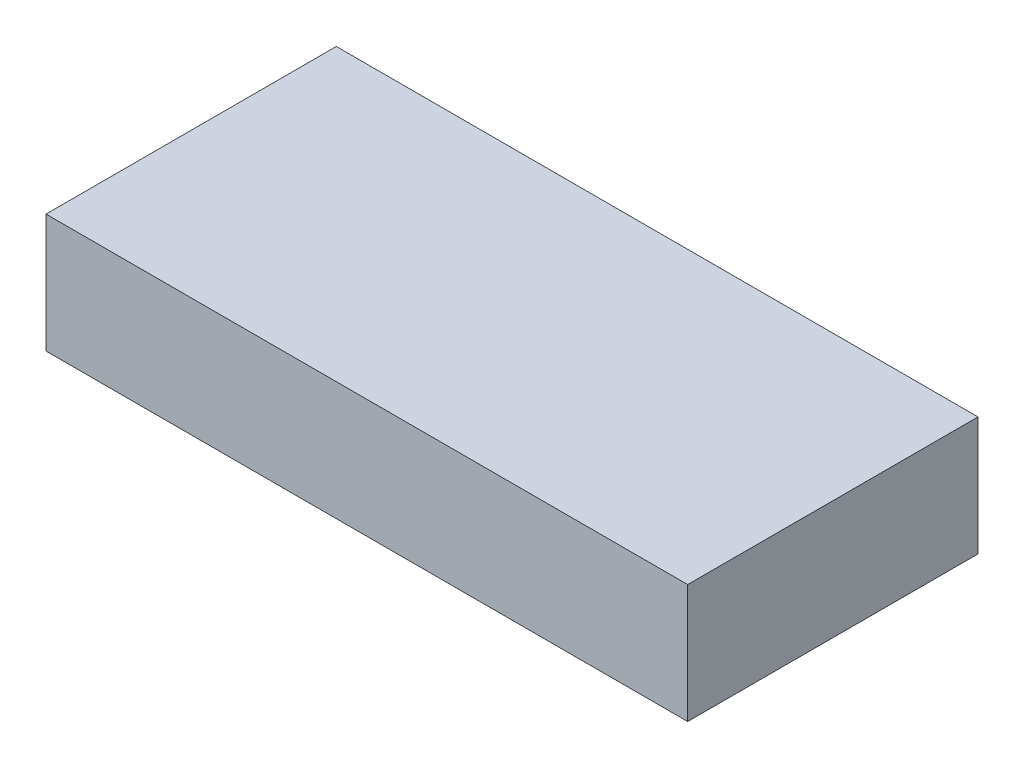
ISO-10303-21;
HEADER;
FILE_DESCRIPTION(('STEP AP214'),'2;1');
FILE_NAME('part.step','',(''),(''),'','','');
FILE_SCHEMA(('AUTOMOTIVE_DESIGN { 1 0 10303 214 1 1 1 1 }'));
ENDSEC;
DATA;
#1=APPLICATION_CONTEXT('core data for automotive mechanical design processes');
#2=APPLICATION_PROTOCOL_DEFINITION('international standard','automotive_design',2000,#1);
#3=PRODUCT_CONTEXT('',#1,'mechanical');
#4=PRODUCT('Part','Part','',(#3));
#5=PRODUCT_RELATED_PRODUCT_CATEGORY('part','',(#4));
#6=PRODUCT_DEFINITION_FORMATION('','',#4);
#7=PRODUCT_DEFINITION_CONTEXT('part definition',#1,'design');
#8=PRODUCT_DEFINITION('design','',#6,#7);
#9=PRODUCT_DEFINITION_SHAPE('','',#8);
#10=(LENGTH_UNIT() NAMED_UNIT(*) SI_UNIT(.MILLI.,.METRE.));
#11=(NAMED_UNIT(*) PLANE_ANGLE_UNIT() SI_UNIT($,.RADIAN.));
#12=(NAMED_UNIT(*) SI_UNIT($,.STERADIAN.) SOLID_ANGLE_UNIT());
#13=UNCERTAINTY_MEASURE_WITH_UNIT(LENGTH_MEASURE(1.E-05),#10,'distance_accuracy_value','');
#14=(GEOMETRIC_REPRESENTATION_CONTEXT(3) GLOBAL_UNCERTAINTY_ASSIGNED_CONTEXT((#13)) GLOBAL_UNIT_ASSIGNED_CONTEXT((#10,
#11,#12)) REPRESENTATION_CONTEXT('',''));
#15=CARTESIAN_POINT('',(0.,0.,0.));
#16=DIRECTION('',(0.,0.,1.));
#17=DIRECTION('',(1.,0.,0.));
#18=AXIS2_PLACEMENT_3D('',#15,#16,#17);
#19=CARTESIAN_POINT('',(0.,19.82,0.));
#20=DIRECTION('',(1.,0.,0.));
#21=DIRECTION('',(0.,0.,-1.));
#22=AXIS2_PLACEMENT_3D('',#19,#20,#21);
#23=PLANE('',#22);
#24=DIRECTION('',(0.,0.,1.));
#25=VECTOR('',#24,1.);
#26=CARTESIAN_POINT('',(0.,0.,0.));
#27=LINE('',#26,#25);
#28=CARTESIAN_POINT('',(0.,0.,-48.5));
#29=VERTEX_POINT('',#28);
#30=CARTESIAN_POINT('',(0.,0.,0.));
#31=VERTEX_POINT('',#30);
#32=EDGE_CURVE('E104',#29,#31,#27,.T.);
#33=ORIENTED_EDGE('',*,*,#32,.T.);
#34=DIRECTION('',(0.,-1.,0.));
#35=VECTOR('',#34,1.);
#36=CARTESIAN_POINT('',(0.,19.82,0.));
#37=LINE('',#36,#35);
#38=CARTESIAN_POINT('',(0.,19.82,0.));
#39=VERTEX_POINT('',#38);
#40=EDGE_CURVE('E11',#39,#31,#37,.T.);
#41=ORIENTED_EDGE('',*,*,#40,.F.);
#42=DIRECTION('',(0.,0.,1.));
#43=VECTOR('',#42,1.);
#44=CARTESIAN_POINT('',(0.,19.82,0.));
#45=LINE('',#44,#43);
#46=CARTESIAN_POINT('',(0.,19.82,-48.5));
#47=VERTEX_POINT('',#46);
#48=EDGE_CURVE('E92',#47,#39,#45,.T.);
#49=ORIENTED_EDGE('',*,*,#48,.F.);
#50=DIRECTION('',(0.,-1.,0.));
#51=VECTOR('',#50,1.);
#52=CARTESIAN_POINT('',(0.,19.82,-48.5));
#53=LINE('',#52,#51);
#54=EDGE_CURVE('E100',#47,#29,#53,.T.);
#55=ORIENTED_EDGE('',*,*,#54,.T.);
#56=EDGE_LOOP('',(#33,#41,#49,#55));
#57=FACE_BOUND('',#56,.T.);
#58=ADVANCED_FACE('F41',(#57),#23,.F.);
#59=CARTESIAN_POINT('',(0.,19.82,0.));
#60=DIRECTION('',(0.,0.,-1.));
#61=DIRECTION('',(-1.,0.,0.));
#62=AXIS2_PLACEMENT_3D('',#59,#60,#61);
#63=PLANE('',#62);
#64=DIRECTION('',(1.,0.,0.));
#65=VECTOR('',#64,1.);
#66=CARTESIAN_POINT('',(0.,0.,0.));
#67=LINE('',#66,#65);
#68=CARTESIAN_POINT('',(107.2,0.,0.));
#69=VERTEX_POINT('',#68);
#70=EDGE_CURVE('E96',#31,#69,#67,.T.);
#71=ORIENTED_EDGE('',*,*,#70,.T.);
#72=DIRECTION('',(0.,-1.,0.));
#73=VECTOR('',#72,1.);
#74=CARTESIAN_POINT('',(107.2,19.82,0.));
#75=LINE('',#74,#73);
#76=CARTESIAN_POINT('',(107.2,19.82,0.));
#77=VERTEX_POINT('',#76);
#78=EDGE_CURVE('E49',#77,#69,#75,.T.);
#79=ORIENTED_EDGE('',*,*,#78,.F.);
#80=DIRECTION('',(1.,0.,0.));
#81=VECTOR('',#80,1.);
#82=CARTESIAN_POINT('',(0.,19.82,0.));
#83=LINE('',#82,#81);
#84=EDGE_CURVE('E87',#39,#77,#83,.T.);
#85=ORIENTED_EDGE('',*,*,#84,.F.);
#86=ORIENTED_EDGE('',*,*,#40,.T.);
#87=EDGE_LOOP('',(#71,#79,#85,#86));
#88=FACE_BOUND('',#87,.T.);
#89=ADVANCED_FACE('F95',(#88),#63,.F.);
#90=CARTESIAN_POINT('',(107.2,19.82,0.));
#91=DIRECTION('',(-1.,0.,0.));
#92=DIRECTION('',(0.,0.,1.));
#93=AXIS2_PLACEMENT_3D('',#90,#91,#92);
#94=PLANE('',#93);
#95=DIRECTION('',(0.,0.,-1.));
#96=VECTOR('',#95,1.);
#97=CARTESIAN_POINT('',(107.2,0.,0.));
#98=LINE('',#97,#96);
#99=CARTESIAN_POINT('',(107.2,0.,-48.5));
#100=VERTEX_POINT('',#99);
#101=EDGE_CURVE('E74',#69,#100,#98,.T.);
#102=ORIENTED_EDGE('',*,*,#101,.T.);
#103=DIRECTION('',(0.,-1.,0.));
#104=VECTOR('',#103,1.);
#105=CARTESIAN_POINT('',(107.2,19.82,-48.5));
#106=LINE('',#105,#104);
#107=CARTESIAN_POINT('',(107.2,19.82,-48.5));
#108=VERTEX_POINT('',#107);
#109=EDGE_CURVE('E97',#108,#100,#106,.T.);
#110=ORIENTED_EDGE('',*,*,#109,.F.);
#111=DIRECTION('',(0.,0.,-1.));
#112=VECTOR('',#111,1.);
#113=CARTESIAN_POINT('',(107.2,19.82,0.));
#114=LINE('',#113,#112);
#115=EDGE_CURVE('E90',#77,#108,#114,.T.);
#116=ORIENTED_EDGE('',*,*,#115,.F.);
#117=ORIENTED_EDGE('',*,*,#78,.T.);
#118=EDGE_LOOP('',(#102,#110,#116,#117));
#119=FACE_BOUND('',#118,.T.);
#120=ADVANCED_FACE('F98',(#119),#94,.F.);
#121=CARTESIAN_POINT('',(0.,19.82,-48.5));
#122=DIRECTION('',(0.,0.,1.));
#123=DIRECTION('',(1.,0.,0.));
#124=AXIS2_PLACEMENT_3D('',#121,#122,#123);
#125=PLANE('',#124);
#126=DIRECTION('',(-1.,0.,0.));
#127=VECTOR('',#126,1.);
#128=CARTESIAN_POINT('',(0.,0.,-48.5));
#129=LINE('',#128,#127);
#130=EDGE_CURVE('E80',#100,#29,#129,.T.);
#131=ORIENTED_EDGE('',*,*,#130,.T.);
#132=ORIENTED_EDGE('',*,*,#54,.F.);
#133=DIRECTION('',(-1.,0.,0.));
#134=VECTOR('',#133,1.);
#135=CARTESIAN_POINT('',(0.,19.82,-48.5));
#136=LINE('',#135,#134);
#137=EDGE_CURVE('E57',#108,#47,#136,.T.);
#138=ORIENTED_EDGE('',*,*,#137,.F.);
#139=ORIENTED_EDGE('',*,*,#109,.T.);
#140=EDGE_LOOP('',(#131,#132,#138,#139));
#141=FACE_BOUND('',#140,.T.);
#142=ADVANCED_FACE('F111',(#141),#125,.F.);
#143=CARTESIAN_POINT('',(0.,19.82,0.));
#144=DIRECTION('',(0.,-1.,0.));
#145=DIRECTION('',(0.,0.,-1.));
#146=AXIS2_PLACEMENT_3D('',#143,#144,#145);
#147=PLANE('',#146);
#148=ORIENTED_EDGE('',*,*,#48,.T.);
#149=ORIENTED_EDGE('',*,*,#84,.T.);
#150=ORIENTED_EDGE('',*,*,#115,.T.);
#151=ORIENTED_EDGE('',*,*,#137,.T.);
#152=EDGE_LOOP('',(#148,#149,#150,#151));
#153=FACE_BOUND('',#152,.T.);
#154=ADVANCED_FACE('F88',(#153),#147,.F.);
#155=CARTESIAN_POINT('',(0.,0.,0.));
#156=DIRECTION('',(0.,-1.,0.));
#157=DIRECTION('',(0.,0.,-1.));
#158=AXIS2_PLACEMENT_3D('',#155,#156,#157);
#159=PLANE('',#158);
#160=ORIENTED_EDGE('',*,*,#32,.F.);
#161=ORIENTED_EDGE('',*,*,#130,.F.);
#162=ORIENTED_EDGE('',*,*,#101,.F.);
#163=ORIENTED_EDGE('',*,*,#70,.F.);
#164=EDGE_LOOP('',(#160,#161,#162,#163));
#165=FACE_BOUND('',#164,.T.);
#166=ADVANCED_FACE('F114',(#165),#159,.T.);
#167=CLOSED_SHELL('',(#58,#89,#120,#142,#154,#166));
#168=MANIFOLD_SOLID_BREP('B2',#167);
#169=ADVANCED_BREP_SHAPE_REPRESENTATION('',(#18,#168),#14);
#170=SHAPE_DEFINITION_REPRESENTATION(#9,#169);
ENDSEC;
END-ISO-10303-21;
